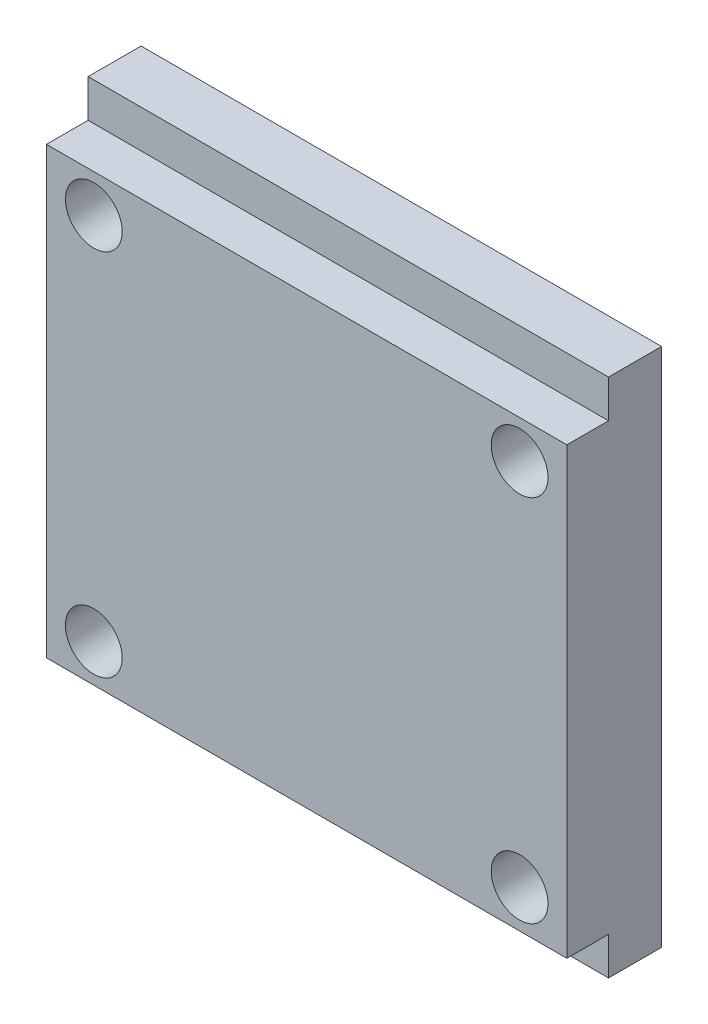
ISO-10303-21;
HEADER;
FILE_DESCRIPTION(('STEP AP214'),'2;1');
FILE_NAME('part.step','',(''),(''),'','','');
FILE_SCHEMA(('AUTOMOTIVE_DESIGN { 1 0 10303 214 1 1 1 1 }'));
ENDSEC;
DATA;
#1=APPLICATION_CONTEXT('core data for automotive mechanical design processes');
#2=APPLICATION_PROTOCOL_DEFINITION('international standard','automotive_design',2000,#1);
#3=PRODUCT_CONTEXT('',#1,'mechanical');
#4=PRODUCT('Part','Part','',(#3));
#5=PRODUCT_RELATED_PRODUCT_CATEGORY('part','',(#4));
#6=PRODUCT_DEFINITION_FORMATION('','',#4);
#7=PRODUCT_DEFINITION_CONTEXT('part definition',#1,'design');
#8=PRODUCT_DEFINITION('design','',#6,#7);
#9=PRODUCT_DEFINITION_SHAPE('','',#8);
#10=(LENGTH_UNIT() NAMED_UNIT(*) SI_UNIT(.MILLI.,.METRE.));
#11=(NAMED_UNIT(*) PLANE_ANGLE_UNIT() SI_UNIT($,.RADIAN.));
#12=(NAMED_UNIT(*) SI_UNIT($,.STERADIAN.) SOLID_ANGLE_UNIT());
#13=UNCERTAINTY_MEASURE_WITH_UNIT(LENGTH_MEASURE(1.E-05),#10,'distance_accuracy_value','');
#14=(GEOMETRIC_REPRESENTATION_CONTEXT(3) GLOBAL_UNCERTAINTY_ASSIGNED_CONTEXT((#13)) GLOBAL_UNIT_ASSIGNED_CONTEXT((#10,
#11,#12)) REPRESENTATION_CONTEXT('',''));
#15=CARTESIAN_POINT('',(0.,0.,0.));
#16=DIRECTION('',(0.,0.,1.));
#17=DIRECTION('',(1.,0.,0.));
#18=AXIS2_PLACEMENT_3D('',#15,#16,#17);
#19=CARTESIAN_POINT('',(0.,32.385,6.35));
#20=DIRECTION('',(0.,-1.,0.));
#21=DIRECTION('',(0.,0.,-1.));
#22=AXIS2_PLACEMENT_3D('',#19,#20,#21);
#23=PLANE('',#22);
#24=DIRECTION('',(0.,0.,1.));
#25=VECTOR('',#24,1.);
#26=CARTESIAN_POINT('',(0.,32.385,0.));
#27=LINE('',#26,#25);
#28=CARTESIAN_POINT('',(0.,32.385,6.35));
#29=VERTEX_POINT('',#28);
#30=CARTESIAN_POINT('',(0.,32.385,3.556));
#31=VERTEX_POINT('',#30);
#32=EDGE_CURVE('E99',#29,#31,#27,.F.);
#33=ORIENTED_EDGE('',*,*,#32,.F.);
#34=DIRECTION('',(1.,0.,0.));
#35=VECTOR('',#34,1.);
#36=CARTESIAN_POINT('',(17.4625,32.385,6.35));
#37=LINE('',#36,#35);
#38=CARTESIAN_POINT('',(34.925,32.385,6.35));
#39=VERTEX_POINT('',#38);
#40=EDGE_CURVE('E98',#39,#29,#37,.F.);
#41=ORIENTED_EDGE('',*,*,#40,.F.);
#42=DIRECTION('',(0.,0.,-1.));
#43=VECTOR('',#42,1.);
#44=CARTESIAN_POINT('',(34.925,32.385,0.));
#45=LINE('',#44,#43);
#46=CARTESIAN_POINT('',(34.925,32.385,3.556));
#47=VERTEX_POINT('',#46);
#48=EDGE_CURVE('E86',#47,#39,#45,.F.);
#49=ORIENTED_EDGE('',*,*,#48,.F.);
#50=DIRECTION('',(1.,0.,0.));
#51=VECTOR('',#50,1.);
#52=CARTESIAN_POINT('',(17.4625,32.385,3.556));
#53=LINE('',#52,#51);
#54=EDGE_CURVE('E80',#31,#47,#53,.T.);
#55=ORIENTED_EDGE('',*,*,#54,.F.);
#56=EDGE_LOOP('',(#33,#41,#49,#55));
#57=FACE_BOUND('',#56,.T.);
#58=ADVANCED_FACE('F17',(#57),#23,.F.);
#59=CARTESIAN_POINT('',(17.4625,33.655,3.556));
#60=DIRECTION('',(0.,0.,1.));
#61=DIRECTION('',(1.,0.,0.));
#62=AXIS2_PLACEMENT_3D('',#59,#60,#61);
#63=PLANE('',#62);
#64=DIRECTION('',(1.,0.,0.));
#65=VECTOR('',#64,1.);
#66=CARTESIAN_POINT('',(0.,34.925,3.556));
#67=LINE('',#66,#65);
#68=CARTESIAN_POINT('',(0.,34.925,3.556));
#69=VERTEX_POINT('',#68);
#70=CARTESIAN_POINT('',(34.925,34.925,3.556));
#71=VERTEX_POINT('',#70);
#72=EDGE_CURVE('E163',#69,#71,#67,.T.);
#73=ORIENTED_EDGE('',*,*,#72,.F.);
#74=DIRECTION('',(0.,1.,0.));
#75=VECTOR('',#74,1.);
#76=CARTESIAN_POINT('',(0.,0.,3.556));
#77=LINE('',#76,#75);
#78=EDGE_CURVE('E158',#31,#69,#77,.T.);
#79=ORIENTED_EDGE('',*,*,#78,.F.);
#80=ORIENTED_EDGE('',*,*,#54,.T.);
#81=DIRECTION('',(0.,1.,0.));
#82=VECTOR('',#81,1.);
#83=CARTESIAN_POINT('',(34.925,34.925,3.556));
#84=LINE('',#83,#82);
#85=EDGE_CURVE('E93',#71,#47,#84,.F.);
#86=ORIENTED_EDGE('',*,*,#85,.F.);
#87=EDGE_LOOP('',(#73,#79,#80,#86));
#88=FACE_BOUND('',#87,.T.);
#89=ADVANCED_FACE('F225',(#88),#63,.T.);
#90=CARTESIAN_POINT('',(34.925,2.54000000000003,6.35));
#91=DIRECTION('',(0.,1.,0.));
#92=DIRECTION('',(0.,0.,1.));
#93=AXIS2_PLACEMENT_3D('',#90,#91,#92);
#94=PLANE('',#93);
#95=DIRECTION('',(0.,0.,-1.));
#96=VECTOR('',#95,1.);
#97=CARTESIAN_POINT('',(34.925,2.54000000000003,0.));
#98=LINE('',#97,#96);
#99=CARTESIAN_POINT('',(34.925,2.54000000000001,6.35));
#100=VERTEX_POINT('',#99);
#101=CARTESIAN_POINT('',(34.925,2.54000000000003,3.556));
#102=VERTEX_POINT('',#101);
#103=EDGE_CURVE('E107',#100,#102,#98,.T.);
#104=ORIENTED_EDGE('',*,*,#103,.F.);
#105=DIRECTION('',(1.,0.,0.));
#106=VECTOR('',#105,1.);
#107=CARTESIAN_POINT('',(17.4625,2.54,6.35));
#108=LINE('',#107,#106);
#109=CARTESIAN_POINT('',(0.,2.54000000000001,6.35));
#110=VERTEX_POINT('',#109);
#111=EDGE_CURVE('E95',#110,#100,#108,.T.);
#112=ORIENTED_EDGE('',*,*,#111,.F.);
#113=DIRECTION('',(0.,0.,1.));
#114=VECTOR('',#113,1.);
#115=CARTESIAN_POINT('',(0.,2.54,0.));
#116=LINE('',#115,#114);
#117=CARTESIAN_POINT('',(0.,2.54000000000002,3.556));
#118=VERTEX_POINT('',#117);
#119=EDGE_CURVE('E151',#118,#110,#116,.T.);
#120=ORIENTED_EDGE('',*,*,#119,.F.);
#121=DIRECTION('',(1.,0.,0.));
#122=VECTOR('',#121,1.);
#123=CARTESIAN_POINT('',(17.4625,2.54000000000003,3.556));
#124=LINE('',#123,#122);
#125=EDGE_CURVE('E103',#102,#118,#124,.F.);
#126=ORIENTED_EDGE('',*,*,#125,.F.);
#127=EDGE_LOOP('',(#104,#112,#120,#126));
#128=FACE_BOUND('',#127,.T.);
#129=ADVANCED_FACE('F227',(#128),#94,.F.);
#130=CARTESIAN_POINT('',(17.4625,1.27,3.556));
#131=DIRECTION('',(0.,0.,1.));
#132=DIRECTION('',(1.,0.,0.));
#133=AXIS2_PLACEMENT_3D('',#130,#131,#132);
#134=PLANE('',#133);
#135=DIRECTION('',(0.,1.,0.));
#136=VECTOR('',#135,1.);
#137=CARTESIAN_POINT('',(0.,0.,3.556));
#138=LINE('',#137,#136);
#139=CARTESIAN_POINT('',(0.,0.,3.556));
#140=VERTEX_POINT('',#139);
#141=EDGE_CURVE('E153',#140,#118,#138,.T.);
#142=ORIENTED_EDGE('',*,*,#141,.F.);
#143=DIRECTION('',(1.,0.,0.));
#144=VECTOR('',#143,1.);
#145=CARTESIAN_POINT('',(34.925,0.,3.556));
#146=LINE('',#145,#144);
#147=CARTESIAN_POINT('',(34.925,0.,3.556));
#148=VERTEX_POINT('',#147);
#149=EDGE_CURVE('E143',#148,#140,#146,.F.);
#150=ORIENTED_EDGE('',*,*,#149,.F.);
#151=DIRECTION('',(0.,1.,0.));
#152=VECTOR('',#151,1.);
#153=CARTESIAN_POINT('',(34.925,34.925,3.556));
#154=LINE('',#153,#152);
#155=EDGE_CURVE('E109',#102,#148,#154,.F.);
#156=ORIENTED_EDGE('',*,*,#155,.F.);
#157=ORIENTED_EDGE('',*,*,#125,.T.);
#158=EDGE_LOOP('',(#142,#150,#156,#157));
#159=FACE_BOUND('',#158,.T.);
#160=ADVANCED_FACE('F170',(#159),#134,.T.);
#161=CARTESIAN_POINT('',(17.4625,17.4625,6.35));
#162=DIRECTION('',(0.,0.,1.));
#163=DIRECTION('',(1.,0.,0.));
#164=AXIS2_PLACEMENT_3D('',#161,#162,#163);
#165=PLANE('',#164);
#166=CARTESIAN_POINT('',(31.75,5.08,6.35));
#167=DIRECTION('',(0.,0.,1.));
#168=DIRECTION('',(1.,0.,0.));
#169=AXIS2_PLACEMENT_3D('',#166,#167,#168);
#170=CIRCLE('',#169,1.905);
#171=CARTESIAN_POINT('',(33.655,5.08,6.35));
#172=VERTEX_POINT('',#171);
#173=EDGE_CURVE('E20',#172,#172,#170,.F.);
#174=ORIENTED_EDGE('',*,*,#173,.T.);
#175=EDGE_LOOP('',(#174));
#176=FACE_BOUND('',#175,.T.);
#177=CARTESIAN_POINT('',(3.175,5.08,6.35));
#178=DIRECTION('',(0.,0.,1.));
#179=DIRECTION('',(1.,0.,0.));
#180=AXIS2_PLACEMENT_3D('',#177,#178,#179);
#181=CIRCLE('',#180,1.905);
#182=CARTESIAN_POINT('',(5.08,5.08,6.35));
#183=VERTEX_POINT('',#182);
#184=EDGE_CURVE('E131',#183,#183,#181,.F.);
#185=ORIENTED_EDGE('',*,*,#184,.T.);
#186=EDGE_LOOP('',(#185));
#187=FACE_BOUND('',#186,.T.);
#188=CARTESIAN_POINT('',(31.75,29.845,6.35));
#189=DIRECTION('',(0.,0.,1.));
#190=DIRECTION('',(1.,0.,0.));
#191=AXIS2_PLACEMENT_3D('',#188,#189,#190);
#192=CIRCLE('',#191,1.905);
#193=CARTESIAN_POINT('',(33.655,29.845,6.35));
#194=VERTEX_POINT('',#193);
#195=EDGE_CURVE('E129',#194,#194,#192,.F.);
#196=ORIENTED_EDGE('',*,*,#195,.T.);
#197=EDGE_LOOP('',(#196));
#198=FACE_BOUND('',#197,.T.);
#199=CARTESIAN_POINT('',(3.175,29.845,6.35));
#200=DIRECTION('',(0.,0.,1.));
#201=DIRECTION('',(1.,0.,0.));
#202=AXIS2_PLACEMENT_3D('',#199,#200,#201);
#203=CIRCLE('',#202,1.905);
#204=CARTESIAN_POINT('',(5.08,29.845,6.35));
#205=VERTEX_POINT('',#204);
#206=EDGE_CURVE('E125',#205,#205,#203,.F.);
#207=ORIENTED_EDGE('',*,*,#206,.T.);
#208=EDGE_LOOP('',(#207));
#209=FACE_BOUND('',#208,.T.);
#210=ORIENTED_EDGE('',*,*,#111,.T.);
#211=DIRECTION('',(0.,1.,0.));
#212=VECTOR('',#211,1.);
#213=CARTESIAN_POINT('',(34.925,34.925,6.35));
#214=LINE('',#213,#212);
#215=EDGE_CURVE('E91',#39,#100,#214,.F.);
#216=ORIENTED_EDGE('',*,*,#215,.F.);
#217=ORIENTED_EDGE('',*,*,#40,.T.);
#218=DIRECTION('',(0.,1.,0.));
#219=VECTOR('',#218,1.);
#220=CARTESIAN_POINT('',(0.,0.,6.35));
#221=LINE('',#220,#219);
#222=EDGE_CURVE('E149',#110,#29,#221,.T.);
#223=ORIENTED_EDGE('',*,*,#222,.F.);
#224=EDGE_LOOP('',(#210,#216,#217,#223));
#225=FACE_BOUND('',#224,.T.);
#226=ADVANCED_FACE('F105',(#176,#187,#198,#209,#225),#165,.T.);
#227=CARTESIAN_POINT('',(34.925,34.925,0.));
#228=DIRECTION('',(1.,0.,0.));
#229=DIRECTION('',(0.,0.,-1.));
#230=AXIS2_PLACEMENT_3D('',#227,#228,#229);
#231=PLANE('',#230);
#232=DIRECTION('',(0.,0.,1.));
#233=VECTOR('',#232,1.);
#234=CARTESIAN_POINT('',(34.925,34.925,0.));
#235=LINE('',#234,#233);
#236=CARTESIAN_POINT('',(34.925,34.925,0.));
#237=VERTEX_POINT('',#236);
#238=EDGE_CURVE('E161',#71,#237,#235,.F.);
#239=ORIENTED_EDGE('',*,*,#238,.F.);
#240=ORIENTED_EDGE('',*,*,#85,.T.);
#241=ORIENTED_EDGE('',*,*,#48,.T.);
#242=ORIENTED_EDGE('',*,*,#215,.T.);
#243=ORIENTED_EDGE('',*,*,#103,.T.);
#244=ORIENTED_EDGE('',*,*,#155,.T.);
#245=DIRECTION('',(0.,0.,-1.));
#246=VECTOR('',#245,1.);
#247=CARTESIAN_POINT('',(34.925,0.,0.));
#248=LINE('',#247,#246);
#249=CARTESIAN_POINT('',(34.925,0.,0.));
#250=VERTEX_POINT('',#249);
#251=EDGE_CURVE('E136',#250,#148,#248,.F.);
#252=ORIENTED_EDGE('',*,*,#251,.F.);
#253=DIRECTION('',(0.,1.,0.));
#254=VECTOR('',#253,1.);
#255=CARTESIAN_POINT('',(34.925,17.4625,0.));
#256=LINE('',#255,#254);
#257=EDGE_CURVE('E128',#250,#237,#256,.T.);
#258=ORIENTED_EDGE('',*,*,#257,.T.);
#259=EDGE_LOOP('',(#239,#240,#241,#242,#243,#244,#252,#258));
#260=FACE_BOUND('',#259,.T.);
#261=ADVANCED_FACE('F89',(#260),#231,.T.);
#262=CARTESIAN_POINT('',(0.,34.925,0.));
#263=DIRECTION('',(0.,1.,0.));
#264=DIRECTION('',(0.,0.,1.));
#265=AXIS2_PLACEMENT_3D('',#262,#263,#264);
#266=PLANE('',#265);
#267=DIRECTION('',(1.,0.,0.));
#268=VECTOR('',#267,1.);
#269=CARTESIAN_POINT('',(17.4625,34.925,0.));
#270=LINE('',#269,#268);
#271=CARTESIAN_POINT('',(0.,34.925,0.));
#272=VERTEX_POINT('',#271);
#273=EDGE_CURVE('E219',#237,#272,#270,.F.);
#274=ORIENTED_EDGE('',*,*,#273,.T.);
#275=DIRECTION('',(0.,0.,1.));
#276=VECTOR('',#275,1.);
#277=CARTESIAN_POINT('',(0.,34.925,0.));
#278=LINE('',#277,#276);
#279=EDGE_CURVE('E156',#69,#272,#278,.F.);
#280=ORIENTED_EDGE('',*,*,#279,.F.);
#281=ORIENTED_EDGE('',*,*,#72,.T.);
#282=ORIENTED_EDGE('',*,*,#238,.T.);
#283=EDGE_LOOP('',(#274,#280,#281,#282));
#284=FACE_BOUND('',#283,.T.);
#285=ADVANCED_FACE('F184',(#284),#266,.T.);
#286=CARTESIAN_POINT('',(0.,0.,0.));
#287=DIRECTION('',(-1.,0.,0.));
#288=DIRECTION('',(0.,0.,1.));
#289=AXIS2_PLACEMENT_3D('',#286,#287,#288);
#290=PLANE('',#289);
#291=ORIENTED_EDGE('',*,*,#119,.T.);
#292=ORIENTED_EDGE('',*,*,#222,.T.);
#293=ORIENTED_EDGE('',*,*,#32,.T.);
#294=ORIENTED_EDGE('',*,*,#78,.T.);
#295=ORIENTED_EDGE('',*,*,#279,.T.);
#296=DIRECTION('',(0.,1.,0.));
#297=VECTOR('',#296,1.);
#298=CARTESIAN_POINT('',(0.,17.4625,0.));
#299=LINE('',#298,#297);
#300=CARTESIAN_POINT('',(0.,0.,0.));
#301=VERTEX_POINT('',#300);
#302=EDGE_CURVE('E217',#272,#301,#299,.F.);
#303=ORIENTED_EDGE('',*,*,#302,.T.);
#304=DIRECTION('',(0.,0.,-1.));
#305=VECTOR('',#304,1.);
#306=CARTESIAN_POINT('',(0.,0.,0.));
#307=LINE('',#306,#305);
#308=EDGE_CURVE('E35',#140,#301,#307,.T.);
#309=ORIENTED_EDGE('',*,*,#308,.F.);
#310=ORIENTED_EDGE('',*,*,#141,.T.);
#311=EDGE_LOOP('',(#291,#292,#293,#294,#295,#303,#309,#310));
#312=FACE_BOUND('',#311,.T.);
#313=ADVANCED_FACE('F174',(#312),#290,.T.);
#314=CARTESIAN_POINT('',(34.925,0.,0.));
#315=DIRECTION('',(0.,-1.,0.));
#316=DIRECTION('',(0.,0.,-1.));
#317=AXIS2_PLACEMENT_3D('',#314,#315,#316);
#318=PLANE('',#317);
#319=DIRECTION('',(1.,0.,0.));
#320=VECTOR('',#319,1.);
#321=CARTESIAN_POINT('',(17.4625,0.,0.));
#322=LINE('',#321,#320);
#323=EDGE_CURVE('E124',#301,#250,#322,.T.);
#324=ORIENTED_EDGE('',*,*,#323,.T.);
#325=ORIENTED_EDGE('',*,*,#251,.T.);
#326=ORIENTED_EDGE('',*,*,#149,.T.);
#327=ORIENTED_EDGE('',*,*,#308,.T.);
#328=EDGE_LOOP('',(#324,#325,#326,#327));
#329=FACE_BOUND('',#328,.T.);
#330=ADVANCED_FACE('F171',(#329),#318,.T.);
#331=CARTESIAN_POINT('',(31.75,5.08,0.));
#332=DIRECTION('',(0.,0.,1.));
#333=DIRECTION('',(1.,0.,0.));
#334=AXIS2_PLACEMENT_3D('',#331,#332,#333);
#335=CYLINDRICAL_SURFACE('',#334,1.905);
#336=CARTESIAN_POINT('',(31.75,5.08,0.));
#337=DIRECTION('',(0.,0.,1.));
#338=DIRECTION('',(1.,0.,0.));
#339=AXIS2_PLACEMENT_3D('',#336,#337,#338);
#340=CIRCLE('',#339,1.905);
#341=CARTESIAN_POINT('',(33.655,5.08,0.));
#342=VERTEX_POINT('',#341);
#343=EDGE_CURVE('E121',#342,#342,#340,.F.);
#344=ORIENTED_EDGE('',*,*,#343,.T.);
#345=EDGE_LOOP('',(#344));
#346=FACE_BOUND('',#345,.T.);
#347=ORIENTED_EDGE('',*,*,#173,.F.);
#348=EDGE_LOOP('',(#347));
#349=FACE_BOUND('',#348,.T.);
#350=ADVANCED_FACE('F173',(#346,#349),#335,.F.);
#351=CARTESIAN_POINT('',(3.175,5.08,0.));
#352=DIRECTION('',(0.,0.,1.));
#353=DIRECTION('',(1.,0.,0.));
#354=AXIS2_PLACEMENT_3D('',#351,#352,#353);
#355=CYLINDRICAL_SURFACE('',#354,1.905);
#356=CARTESIAN_POINT('',(3.175,5.08,0.));
#357=DIRECTION('',(0.,0.,1.));
#358=DIRECTION('',(1.,0.,0.));
#359=AXIS2_PLACEMENT_3D('',#356,#357,#358);
#360=CIRCLE('',#359,1.905);
#361=CARTESIAN_POINT('',(5.08,5.08,0.));
#362=VERTEX_POINT('',#361);
#363=EDGE_CURVE('E118',#362,#362,#360,.F.);
#364=ORIENTED_EDGE('',*,*,#363,.T.);
#365=EDGE_LOOP('',(#364));
#366=FACE_BOUND('',#365,.T.);
#367=ORIENTED_EDGE('',*,*,#184,.F.);
#368=EDGE_LOOP('',(#367));
#369=FACE_BOUND('',#368,.T.);
#370=ADVANCED_FACE('F181',(#366,#369),#355,.F.);
#371=CARTESIAN_POINT('',(31.75,29.845,0.));
#372=DIRECTION('',(0.,0.,1.));
#373=DIRECTION('',(1.,0.,0.));
#374=AXIS2_PLACEMENT_3D('',#371,#372,#373);
#375=CYLINDRICAL_SURFACE('',#374,1.905);
#376=CARTESIAN_POINT('',(31.75,29.845,0.));
#377=DIRECTION('',(0.,0.,1.));
#378=DIRECTION('',(1.,0.,0.));
#379=AXIS2_PLACEMENT_3D('',#376,#377,#378);
#380=CIRCLE('',#379,1.905);
#381=CARTESIAN_POINT('',(33.655,29.845,0.));
#382=VERTEX_POINT('',#381);
#383=EDGE_CURVE('E26',#382,#382,#380,.F.);
#384=ORIENTED_EDGE('',*,*,#383,.T.);
#385=EDGE_LOOP('',(#384));
#386=FACE_BOUND('',#385,.T.);
#387=ORIENTED_EDGE('',*,*,#195,.F.);
#388=EDGE_LOOP('',(#387));
#389=FACE_BOUND('',#388,.T.);
#390=ADVANCED_FACE('F195',(#386,#389),#375,.F.);
#391=CARTESIAN_POINT('',(3.175,29.845,0.));
#392=DIRECTION('',(0.,0.,1.));
#393=DIRECTION('',(1.,0.,0.));
#394=AXIS2_PLACEMENT_3D('',#391,#392,#393);
#395=CYLINDRICAL_SURFACE('',#394,1.905);
#396=CARTESIAN_POINT('',(3.175,29.845,0.));
#397=DIRECTION('',(0.,0.,1.));
#398=DIRECTION('',(1.,0.,0.));
#399=AXIS2_PLACEMENT_3D('',#396,#397,#398);
#400=CIRCLE('',#399,1.905);
#401=CARTESIAN_POINT('',(5.08,29.845,0.));
#402=VERTEX_POINT('',#401);
#403=EDGE_CURVE('E11',#402,#402,#400,.F.);
#404=ORIENTED_EDGE('',*,*,#403,.T.);
#405=EDGE_LOOP('',(#404));
#406=FACE_BOUND('',#405,.T.);
#407=ORIENTED_EDGE('',*,*,#206,.F.);
#408=EDGE_LOOP('',(#407));
#409=FACE_BOUND('',#408,.T.);
#410=ADVANCED_FACE('F189',(#406,#409),#395,.F.);
#411=CARTESIAN_POINT('',(17.4625,17.4625,0.));
#412=DIRECTION('',(0.,0.,1.));
#413=DIRECTION('',(1.,0.,0.));
#414=AXIS2_PLACEMENT_3D('',#411,#412,#413);
#415=PLANE('',#414);
#416=ORIENTED_EDGE('',*,*,#403,.F.);
#417=EDGE_LOOP('',(#416));
#418=FACE_BOUND('',#417,.T.);
#419=ORIENTED_EDGE('',*,*,#383,.F.);
#420=EDGE_LOOP('',(#419));
#421=FACE_BOUND('',#420,.T.);
#422=ORIENTED_EDGE('',*,*,#363,.F.);
#423=EDGE_LOOP('',(#422));
#424=FACE_BOUND('',#423,.T.);
#425=ORIENTED_EDGE('',*,*,#343,.F.);
#426=EDGE_LOOP('',(#425));
#427=FACE_BOUND('',#426,.T.);
#428=ORIENTED_EDGE('',*,*,#302,.F.);
#429=ORIENTED_EDGE('',*,*,#273,.F.);
#430=ORIENTED_EDGE('',*,*,#257,.F.);
#431=ORIENTED_EDGE('',*,*,#323,.F.);
#432=EDGE_LOOP('',(#428,#429,#430,#431));
#433=FACE_BOUND('',#432,.T.);
#434=ADVANCED_FACE('F187',(#418,#421,#424,#427,#433),#415,.F.);
#435=CLOSED_SHELL('',(#58,#89,#129,#160,#226,#261,#285,#313,#330,#350,#370,#390,#410,#434));
#436=MANIFOLD_SOLID_BREP('B1',#435);
#437=ADVANCED_BREP_SHAPE_REPRESENTATION('',(#18,#436),#14);
#438=SHAPE_DEFINITION_REPRESENTATION(#9,#437);
ENDSEC;
END-ISO-10303-21;
